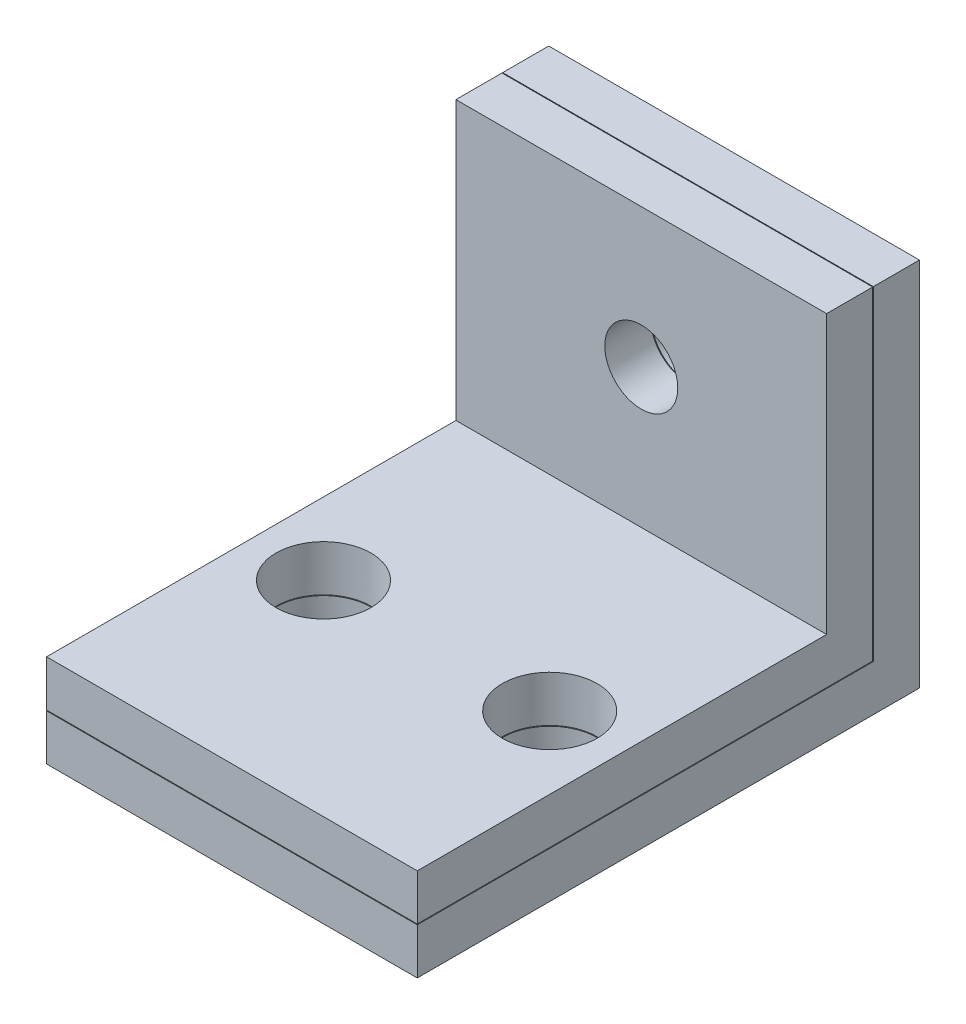
ISO-10303-21;
HEADER;
FILE_DESCRIPTION(('STEP AP214'),'2;1');
FILE_NAME('part.step','',(''),(''),'','','');
FILE_SCHEMA(('AUTOMOTIVE_DESIGN { 1 0 10303 214 1 1 1 1 }'));
ENDSEC;
DATA;
#1=APPLICATION_CONTEXT('core data for automotive mechanical design processes');
#2=APPLICATION_PROTOCOL_DEFINITION('international standard','automotive_design',2000,#1);
#3=PRODUCT_CONTEXT('',#1,'mechanical');
#4=PRODUCT('Part','Part','',(#3));
#5=PRODUCT_RELATED_PRODUCT_CATEGORY('part','',(#4));
#6=PRODUCT_DEFINITION_FORMATION('','',#4);
#7=PRODUCT_DEFINITION_CONTEXT('part definition',#1,'design');
#8=PRODUCT_DEFINITION('design','',#6,#7);
#9=PRODUCT_DEFINITION_SHAPE('','',#8);
#10=(LENGTH_UNIT() NAMED_UNIT(*) SI_UNIT(.MILLI.,.METRE.));
#11=(NAMED_UNIT(*) PLANE_ANGLE_UNIT() SI_UNIT($,.RADIAN.));
#12=(NAMED_UNIT(*) SI_UNIT($,.STERADIAN.) SOLID_ANGLE_UNIT());
#13=UNCERTAINTY_MEASURE_WITH_UNIT(LENGTH_MEASURE(1.E-05),#10,'distance_accuracy_value','');
#14=(GEOMETRIC_REPRESENTATION_CONTEXT(3) GLOBAL_UNCERTAINTY_ASSIGNED_CONTEXT((#13)) GLOBAL_UNIT_ASSIGNED_CONTEXT((#10,
#11,#12)) REPRESENTATION_CONTEXT('',''));
#15=CARTESIAN_POINT('',(0.,0.,0.));
#16=DIRECTION('',(0.,0.,1.));
#17=DIRECTION('',(1.,0.,0.));
#18=AXIS2_PLACEMENT_3D('',#15,#16,#17);
#19=CARTESIAN_POINT('',(0.,12.72,0.));
#20=DIRECTION('',(0.,0.,1.));
#21=DIRECTION('',(1.,0.,0.));
#22=AXIS2_PLACEMENT_3D('',#19,#20,#21);
#23=PLANE('',#22);
#24=DIRECTION('',(0.,-1.,0.));
#25=VECTOR('',#24,1.);
#26=CARTESIAN_POINT('',(50.8,12.72,0.));
#27=LINE('',#26,#25);
#28=CARTESIAN_POINT('',(50.8,12.72,0.));
#29=VERTEX_POINT('',#28);
#30=CARTESIAN_POINT('',(50.8,6.41,0.));
#31=VERTEX_POINT('',#30);
#32=EDGE_CURVE('E129',#29,#31,#27,.T.);
#33=ORIENTED_EDGE('',*,*,#32,.F.);
#34=DIRECTION('',(1.,0.,0.));
#35=VECTOR('',#34,1.);
#36=CARTESIAN_POINT('',(0.,12.72,0.));
#37=LINE('',#36,#35);
#38=CARTESIAN_POINT('',(0.,12.72,0.));
#39=VERTEX_POINT('',#38);
#40=EDGE_CURVE('E12',#39,#29,#37,.T.);
#41=ORIENTED_EDGE('',*,*,#40,.F.);
#42=DIRECTION('',(0.,-1.,0.));
#43=VECTOR('',#42,1.);
#44=CARTESIAN_POINT('',(0.,12.72,0.));
#45=LINE('',#44,#43);
#46=CARTESIAN_POINT('',(0.,6.41,0.));
#47=VERTEX_POINT('',#46);
#48=EDGE_CURVE('E144',#39,#47,#45,.T.);
#49=ORIENTED_EDGE('',*,*,#48,.T.);
#50=DIRECTION('',(1.,0.,0.));
#51=VECTOR('',#50,1.);
#52=CARTESIAN_POINT('',(0.,6.41,0.));
#53=LINE('',#52,#51);
#54=EDGE_CURVE('E93',#47,#31,#53,.T.);
#55=ORIENTED_EDGE('',*,*,#54,.T.);
#56=EDGE_LOOP('',(#33,#41,#49,#55));
#57=FACE_BOUND('',#56,.T.);
#58=ADVANCED_FACE('F43',(#57),#23,.T.);
#59=CARTESIAN_POINT('',(0.,12.72,0.));
#60=DIRECTION('',(0.,1.,0.));
#61=DIRECTION('',(0.,0.,1.));
#62=AXIS2_PLACEMENT_3D('',#59,#60,#61);
#63=PLANE('',#62);
#64=CARTESIAN_POINT('',(9.9,12.72,-28.05));
#65=DIRECTION('',(0.,1.,0.));
#66=DIRECTION('',(0.,0.,1.));
#67=AXIS2_PLACEMENT_3D('',#64,#65,#66);
#68=CIRCLE('',#67,6.50000000000001);
#69=CARTESIAN_POINT('',(9.9,12.72,-21.55));
#70=VERTEX_POINT('',#69);
#71=EDGE_CURVE('E153',#70,#70,#68,.T.);
#72=ORIENTED_EDGE('',*,*,#71,.F.);
#73=EDGE_LOOP('',(#72));
#74=FACE_BOUND('',#73,.T.);
#75=CARTESIAN_POINT('',(40.9,12.72,-28.05));
#76=DIRECTION('',(0.,1.,0.));
#77=DIRECTION('',(0.,0.,1.));
#78=AXIS2_PLACEMENT_3D('',#75,#76,#77);
#79=CIRCLE('',#78,6.5);
#80=CARTESIAN_POINT('',(40.9,12.72,-21.55));
#81=VERTEX_POINT('',#80);
#82=EDGE_CURVE('E170',#81,#81,#79,.T.);
#83=ORIENTED_EDGE('',*,*,#82,.F.);
#84=EDGE_LOOP('',(#83));
#85=FACE_BOUND('',#84,.T.);
#86=DIRECTION('',(0.,0.,1.));
#87=VECTOR('',#86,1.);
#88=CARTESIAN_POINT('',(50.8,12.72,0.));
#89=LINE('',#88,#87);
#90=CARTESIAN_POINT('',(50.8,12.72,-56.1));
#91=VERTEX_POINT('',#90);
#92=EDGE_CURVE('E142',#91,#29,#89,.T.);
#93=ORIENTED_EDGE('',*,*,#92,.F.);
#94=DIRECTION('',(1.,0.,0.));
#95=VECTOR('',#94,1.);
#96=CARTESIAN_POINT('',(0.,12.72,-56.1));
#97=LINE('',#96,#95);
#98=CARTESIAN_POINT('',(0.,12.72,-56.1));
#99=VERTEX_POINT('',#98);
#100=EDGE_CURVE('E52',#99,#91,#97,.T.);
#101=ORIENTED_EDGE('',*,*,#100,.F.);
#102=DIRECTION('',(0.,0.,1.));
#103=VECTOR('',#102,1.);
#104=CARTESIAN_POINT('',(0.,12.72,0.));
#105=LINE('',#104,#103);
#106=EDGE_CURVE('E119',#99,#39,#105,.T.);
#107=ORIENTED_EDGE('',*,*,#106,.T.);
#108=ORIENTED_EDGE('',*,*,#40,.T.);
#109=EDGE_LOOP('',(#93,#101,#107,#108));
#110=FACE_BOUND('',#109,.T.);
#111=ADVANCED_FACE('F187',(#74,#85,#110),#63,.T.);
#112=CARTESIAN_POINT('',(0.,12.72,-56.1));
#113=DIRECTION('',(0.,0.,1.));
#114=DIRECTION('',(1.,0.,0.));
#115=AXIS2_PLACEMENT_3D('',#112,#113,#114);
#116=PLANE('',#115);
#117=CARTESIAN_POINT('',(25.4,31.76,-56.1));
#118=DIRECTION('',(0.,0.,1.));
#119=DIRECTION('',(1.,0.,0.));
#120=AXIS2_PLACEMENT_3D('',#117,#118,#119);
#121=CIRCLE('',#120,5.);
#122=CARTESIAN_POINT('',(30.4,31.76,-56.1));
#123=VERTEX_POINT('',#122);
#124=EDGE_CURVE('E175',#123,#123,#121,.T.);
#125=ORIENTED_EDGE('',*,*,#124,.F.);
#126=EDGE_LOOP('',(#125));
#127=FACE_BOUND('',#126,.T.);
#128=DIRECTION('',(0.,-1.,0.));
#129=VECTOR('',#128,1.);
#130=CARTESIAN_POINT('',(50.8,12.72,-56.1));
#131=LINE('',#130,#129);
#132=CARTESIAN_POINT('',(50.8,50.8,-56.1));
#133=VERTEX_POINT('',#132);
#134=EDGE_CURVE('E106',#133,#91,#131,.T.);
#135=ORIENTED_EDGE('',*,*,#134,.F.);
#136=DIRECTION('',(1.,0.,0.));
#137=VECTOR('',#136,1.);
#138=CARTESIAN_POINT('',(0.,50.8,-56.1));
#139=LINE('',#138,#137);
#140=CARTESIAN_POINT('',(0.,50.8,-56.1));
#141=VERTEX_POINT('',#140);
#142=EDGE_CURVE('E101',#141,#133,#139,.T.);
#143=ORIENTED_EDGE('',*,*,#142,.F.);
#144=DIRECTION('',(0.,-1.,0.));
#145=VECTOR('',#144,1.);
#146=CARTESIAN_POINT('',(0.,12.72,-56.1));
#147=LINE('',#146,#145);
#148=EDGE_CURVE('E104',#141,#99,#147,.T.);
#149=ORIENTED_EDGE('',*,*,#148,.T.);
#150=ORIENTED_EDGE('',*,*,#100,.T.);
#151=EDGE_LOOP('',(#135,#143,#149,#150));
#152=FACE_BOUND('',#151,.T.);
#153=ADVANCED_FACE('F103',(#127,#152),#116,.T.);
#154=CARTESIAN_POINT('',(0.,50.8,-56.1));
#155=DIRECTION('',(0.,1.,0.));
#156=DIRECTION('',(0.,0.,1.));
#157=AXIS2_PLACEMENT_3D('',#154,#155,#156);
#158=PLANE('',#157);
#159=DIRECTION('',(0.,0.,1.));
#160=VECTOR('',#159,1.);
#161=CARTESIAN_POINT('',(50.8,50.8,-56.1));
#162=LINE('',#161,#160);
#163=CARTESIAN_POINT('',(50.8,50.8,-62.41));
#164=VERTEX_POINT('',#163);
#165=EDGE_CURVE('E139',#164,#133,#162,.T.);
#166=ORIENTED_EDGE('',*,*,#165,.F.);
#167=DIRECTION('',(1.,0.,0.));
#168=VECTOR('',#167,1.);
#169=CARTESIAN_POINT('',(0.,50.8,-62.41));
#170=LINE('',#169,#168);
#171=CARTESIAN_POINT('',(0.,50.8,-62.41));
#172=VERTEX_POINT('',#171);
#173=EDGE_CURVE('E111',#172,#164,#170,.T.);
#174=ORIENTED_EDGE('',*,*,#173,.F.);
#175=DIRECTION('',(0.,0.,1.));
#176=VECTOR('',#175,1.);
#177=CARTESIAN_POINT('',(0.,50.8,-56.1));
#178=LINE('',#177,#176);
#179=EDGE_CURVE('E117',#172,#141,#178,.T.);
#180=ORIENTED_EDGE('',*,*,#179,.T.);
#181=ORIENTED_EDGE('',*,*,#142,.T.);
#182=EDGE_LOOP('',(#166,#174,#180,#181));
#183=FACE_BOUND('',#182,.T.);
#184=ADVANCED_FACE('F121',(#183),#158,.T.);
#185=CARTESIAN_POINT('',(0.,6.41,-62.41));
#186=DIRECTION('',(0.,0.,-1.));
#187=DIRECTION('',(-1.,0.,0.));
#188=AXIS2_PLACEMENT_3D('',#185,#186,#187);
#189=PLANE('',#188);
#190=CARTESIAN_POINT('',(25.4,31.76,-62.41));
#191=DIRECTION('',(0.,0.,-1.));
#192=DIRECTION('',(-1.,0.,0.));
#193=AXIS2_PLACEMENT_3D('',#190,#191,#192);
#194=CIRCLE('',#193,5.);
#195=CARTESIAN_POINT('',(20.4,31.76,-62.41));
#196=VERTEX_POINT('',#195);
#197=EDGE_CURVE('E46',#196,#196,#194,.T.);
#198=ORIENTED_EDGE('',*,*,#197,.F.);
#199=EDGE_LOOP('',(#198));
#200=FACE_BOUND('',#199,.T.);
#201=DIRECTION('',(0.,1.,0.));
#202=VECTOR('',#201,1.);
#203=CARTESIAN_POINT('',(50.8,6.41,-62.41));
#204=LINE('',#203,#202);
#205=CARTESIAN_POINT('',(50.8,6.41,-62.41));
#206=VERTEX_POINT('',#205);
#207=EDGE_CURVE('E136',#206,#164,#204,.T.);
#208=ORIENTED_EDGE('',*,*,#207,.F.);
#209=DIRECTION('',(1.,0.,0.));
#210=VECTOR('',#209,1.);
#211=CARTESIAN_POINT('',(0.,6.41,-62.41));
#212=LINE('',#211,#210);
#213=CARTESIAN_POINT('',(0.,6.41,-62.41));
#214=VERTEX_POINT('',#213);
#215=EDGE_CURVE('E148',#214,#206,#212,.T.);
#216=ORIENTED_EDGE('',*,*,#215,.F.);
#217=DIRECTION('',(0.,1.,0.));
#218=VECTOR('',#217,1.);
#219=CARTESIAN_POINT('',(0.,6.41,-62.41));
#220=LINE('',#219,#218);
#221=EDGE_CURVE('E122',#214,#172,#220,.T.);
#222=ORIENTED_EDGE('',*,*,#221,.T.);
#223=ORIENTED_EDGE('',*,*,#173,.T.);
#224=EDGE_LOOP('',(#208,#216,#222,#223));
#225=FACE_BOUND('',#224,.T.);
#226=ADVANCED_FACE('F163',(#200,#225),#189,.T.);
#227=CARTESIAN_POINT('',(0.,6.41,0.));
#228=DIRECTION('',(0.,-1.,0.));
#229=DIRECTION('',(0.,0.,-1.));
#230=AXIS2_PLACEMENT_3D('',#227,#228,#229);
#231=PLANE('',#230);
#232=CARTESIAN_POINT('',(9.9,6.41,-28.05));
#233=DIRECTION('',(0.,-1.,0.));
#234=DIRECTION('',(0.,0.,-1.));
#235=AXIS2_PLACEMENT_3D('',#232,#233,#234);
#236=CIRCLE('',#235,6.50000000000001);
#237=CARTESIAN_POINT('',(9.9,6.41,-34.55));
#238=VERTEX_POINT('',#237);
#239=EDGE_CURVE('E133',#238,#238,#236,.T.);
#240=ORIENTED_EDGE('',*,*,#239,.F.);
#241=EDGE_LOOP('',(#240));
#242=FACE_BOUND('',#241,.T.);
#243=CARTESIAN_POINT('',(40.9,6.41,-28.05));
#244=DIRECTION('',(0.,-1.,0.));
#245=DIRECTION('',(0.,0.,-1.));
#246=AXIS2_PLACEMENT_3D('',#243,#244,#245);
#247=CIRCLE('',#246,6.5);
#248=CARTESIAN_POINT('',(40.9,6.41,-34.55));
#249=VERTEX_POINT('',#248);
#250=EDGE_CURVE('E151',#249,#249,#247,.T.);
#251=ORIENTED_EDGE('',*,*,#250,.F.);
#252=EDGE_LOOP('',(#251));
#253=FACE_BOUND('',#252,.T.);
#254=DIRECTION('',(0.,0.,-1.));
#255=VECTOR('',#254,1.);
#256=CARTESIAN_POINT('',(50.8,6.41,0.));
#257=LINE('',#256,#255);
#258=EDGE_CURVE('E132',#31,#206,#257,.T.);
#259=ORIENTED_EDGE('',*,*,#258,.F.);
#260=ORIENTED_EDGE('',*,*,#54,.F.);
#261=DIRECTION('',(0.,0.,-1.));
#262=VECTOR('',#261,1.);
#263=CARTESIAN_POINT('',(0.,6.41,0.));
#264=LINE('',#263,#262);
#265=EDGE_CURVE('E124',#47,#214,#264,.T.);
#266=ORIENTED_EDGE('',*,*,#265,.T.);
#267=ORIENTED_EDGE('',*,*,#215,.T.);
#268=EDGE_LOOP('',(#259,#260,#266,#267));
#269=FACE_BOUND('',#268,.T.);
#270=ADVANCED_FACE('F160',(#242,#253,#269),#231,.T.);
#271=CARTESIAN_POINT('',(0.,0.,0.));
#272=DIRECTION('',(1.,0.,0.));
#273=DIRECTION('',(0.,0.,-1.));
#274=AXIS2_PLACEMENT_3D('',#271,#272,#273);
#275=PLANE('',#274);
#276=ORIENTED_EDGE('',*,*,#48,.F.);
#277=ORIENTED_EDGE('',*,*,#106,.F.);
#278=ORIENTED_EDGE('',*,*,#148,.F.);
#279=ORIENTED_EDGE('',*,*,#179,.F.);
#280=ORIENTED_EDGE('',*,*,#221,.F.);
#281=ORIENTED_EDGE('',*,*,#265,.F.);
#282=EDGE_LOOP('',(#276,#277,#278,#279,#280,#281));
#283=FACE_BOUND('',#282,.T.);
#284=ADVANCED_FACE('F115',(#283),#275,.F.);
#285=CARTESIAN_POINT('',(50.8,0.,0.));
#286=DIRECTION('',(1.,0.,0.));
#287=DIRECTION('',(0.,0.,-1.));
#288=AXIS2_PLACEMENT_3D('',#285,#286,#287);
#289=PLANE('',#288);
#290=ORIENTED_EDGE('',*,*,#32,.T.);
#291=ORIENTED_EDGE('',*,*,#258,.T.);
#292=ORIENTED_EDGE('',*,*,#207,.T.);
#293=ORIENTED_EDGE('',*,*,#165,.T.);
#294=ORIENTED_EDGE('',*,*,#134,.T.);
#295=ORIENTED_EDGE('',*,*,#92,.T.);
#296=EDGE_LOOP('',(#290,#291,#292,#293,#294,#295));
#297=FACE_BOUND('',#296,.T.);
#298=ADVANCED_FACE('F167',(#297),#289,.T.);
#299=CARTESIAN_POINT('',(40.9,-85.08,-28.05));
#300=DIRECTION('',(0.,1.,0.));
#301=DIRECTION('',(0.,0.,1.));
#302=AXIS2_PLACEMENT_3D('',#299,#300,#301);
#303=CYLINDRICAL_SURFACE('',#302,6.5);
#304=ORIENTED_EDGE('',*,*,#250,.T.);
#305=EDGE_LOOP('',(#304));
#306=FACE_BOUND('',#305,.T.);
#307=ORIENTED_EDGE('',*,*,#82,.T.);
#308=EDGE_LOOP('',(#307));
#309=FACE_BOUND('',#308,.T.);
#310=ADVANCED_FACE('F234',(#306,#309),#303,.F.);
#311=CARTESIAN_POINT('',(9.9,-85.08,-28.05));
#312=DIRECTION('',(0.,1.,0.));
#313=DIRECTION('',(0.,0.,1.));
#314=AXIS2_PLACEMENT_3D('',#311,#312,#313);
#315=CYLINDRICAL_SURFACE('',#314,6.50000000000001);
#316=ORIENTED_EDGE('',*,*,#239,.T.);
#317=EDGE_LOOP('',(#316));
#318=FACE_BOUND('',#317,.T.);
#319=ORIENTED_EDGE('',*,*,#71,.T.);
#320=EDGE_LOOP('',(#319));
#321=FACE_BOUND('',#320,.T.);
#322=ADVANCED_FACE('F157',(#318,#321),#315,.F.);
#323=CARTESIAN_POINT('',(25.4,31.76,-78.1));
#324=DIRECTION('',(0.,0.,1.));
#325=DIRECTION('',(1.,0.,0.));
#326=AXIS2_PLACEMENT_3D('',#323,#324,#325);
#327=CYLINDRICAL_SURFACE('',#326,5.);
#328=ORIENTED_EDGE('',*,*,#197,.T.);
#329=EDGE_LOOP('',(#328));
#330=FACE_BOUND('',#329,.T.);
#331=ORIENTED_EDGE('',*,*,#124,.T.);
#332=EDGE_LOOP('',(#331));
#333=FACE_BOUND('',#332,.T.);
#334=ADVANCED_FACE('F182',(#330,#333),#327,.F.);
#335=CLOSED_SHELL('',(#58,#111,#153,#184,#226,#270,#284,#298,#310,#322,#334));
#336=MANIFOLD_SOLID_BREP('B2',#335);
#337=CARTESIAN_POINT('',(50.8,6.31,0.));
#338=DIRECTION('',(0.,0.,-1.));
#339=DIRECTION('',(-1.,0.,0.));
#340=AXIS2_PLACEMENT_3D('',#337,#338,#339);
#341=PLANE('',#340);
#342=DIRECTION('',(0.,-1.,0.));
#343=VECTOR('',#342,1.);
#344=CARTESIAN_POINT('',(0.,6.31,0.));
#345=LINE('',#344,#343);
#346=CARTESIAN_POINT('',(0.,6.31,0.));
#347=VERTEX_POINT('',#346);
#348=CARTESIAN_POINT('',(0.,0.,0.));
#349=VERTEX_POINT('',#348);
#350=EDGE_CURVE('E368',#347,#349,#345,.T.);
#351=ORIENTED_EDGE('',*,*,#350,.T.);
#352=DIRECTION('',(-1.,0.,0.));
#353=VECTOR('',#352,1.);
#354=CARTESIAN_POINT('',(50.8,0.,0.));
#355=LINE('',#354,#353);
#356=CARTESIAN_POINT('',(50.8,0.,0.));
#357=VERTEX_POINT('',#356);
#358=EDGE_CURVE('E41',#357,#349,#355,.T.);
#359=ORIENTED_EDGE('',*,*,#358,.F.);
#360=DIRECTION('',(0.,-1.,0.));
#361=VECTOR('',#360,1.);
#362=CARTESIAN_POINT('',(50.8,6.31,0.));
#363=LINE('',#362,#361);
#364=CARTESIAN_POINT('',(50.8,6.31,0.));
#365=VERTEX_POINT('',#364);
#366=EDGE_CURVE('E379',#365,#357,#363,.T.);
#367=ORIENTED_EDGE('',*,*,#366,.F.);
#368=DIRECTION('',(-1.,0.,0.));
#369=VECTOR('',#368,1.);
#370=CARTESIAN_POINT('',(50.8,6.31,0.));
#371=LINE('',#370,#369);
#372=EDGE_CURVE('E364',#365,#347,#371,.T.);
#373=ORIENTED_EDGE('',*,*,#372,.T.);
#374=EDGE_LOOP('',(#351,#359,#367,#373));
#375=FACE_BOUND('',#374,.T.);
#376=ADVANCED_FACE('F282',(#375),#341,.F.);
#377=CARTESIAN_POINT('',(50.8,0.,0.));
#378=DIRECTION('',(0.,1.,0.));
#379=DIRECTION('',(0.,0.,1.));
#380=AXIS2_PLACEMENT_3D('',#377,#378,#379);
#381=PLANE('',#380);
#382=CARTESIAN_POINT('',(9.9,0.,-28.05));
#383=DIRECTION('',(0.,1.,0.));
#384=DIRECTION('',(0.,0.,1.));
#385=AXIS2_PLACEMENT_3D('',#382,#383,#384);
#386=CIRCLE('',#385,6.50000000000001);
#387=CARTESIAN_POINT('',(9.9,0.,-21.55));
#388=VERTEX_POINT('',#387);
#389=EDGE_CURVE('E372',#388,#388,#386,.T.);
#390=ORIENTED_EDGE('',*,*,#389,.T.);
#391=EDGE_LOOP('',(#390));
#392=FACE_BOUND('',#391,.T.);
#393=CARTESIAN_POINT('',(40.9,0.,-28.05));
#394=DIRECTION('',(0.,1.,0.));
#395=DIRECTION('',(0.,0.,1.));
#396=AXIS2_PLACEMENT_3D('',#393,#394,#395);
#397=CIRCLE('',#396,6.5);
#398=CARTESIAN_POINT('',(40.9,0.,-21.55));
#399=VERTEX_POINT('',#398);
#400=EDGE_CURVE('E387',#399,#399,#397,.T.);
#401=ORIENTED_EDGE('',*,*,#400,.T.);
#402=EDGE_LOOP('',(#401));
#403=FACE_BOUND('',#402,.T.);
#404=DIRECTION('',(0.,0.,-1.));
#405=VECTOR('',#404,1.);
#406=CARTESIAN_POINT('',(0.,0.,0.));
#407=LINE('',#406,#405);
#408=CARTESIAN_POINT('',(0.,0.,-68.82));
#409=VERTEX_POINT('',#408);
#410=EDGE_CURVE('E371',#349,#409,#407,.T.);
#411=ORIENTED_EDGE('',*,*,#410,.T.);
#412=DIRECTION('',(-1.,0.,0.));
#413=VECTOR('',#412,1.);
#414=CARTESIAN_POINT('',(50.8,0.,-68.82));
#415=LINE('',#414,#413);
#416=CARTESIAN_POINT('',(50.8,0.,-68.82));
#417=VERTEX_POINT('',#416);
#418=EDGE_CURVE('E291',#417,#409,#415,.T.);
#419=ORIENTED_EDGE('',*,*,#418,.F.);
#420=DIRECTION('',(0.,0.,-1.));
#421=VECTOR('',#420,1.);
#422=CARTESIAN_POINT('',(50.8,0.,0.));
#423=LINE('',#422,#421);
#424=EDGE_CURVE('E337',#357,#417,#423,.T.);
#425=ORIENTED_EDGE('',*,*,#424,.F.);
#426=ORIENTED_EDGE('',*,*,#358,.T.);
#427=EDGE_LOOP('',(#411,#419,#425,#426));
#428=FACE_BOUND('',#427,.T.);
#429=ADVANCED_FACE('F404',(#392,#403,#428),#381,.F.);
#430=CARTESIAN_POINT('',(50.8,0.,-68.82));
#431=DIRECTION('',(0.,0.,1.));
#432=DIRECTION('',(1.,0.,0.));
#433=AXIS2_PLACEMENT_3D('',#430,#431,#432);
#434=PLANE('',#433);
#435=CARTESIAN_POINT('',(25.4,31.76,-68.82));
#436=DIRECTION('',(0.,0.,1.));
#437=DIRECTION('',(1.,0.,0.));
#438=AXIS2_PLACEMENT_3D('',#435,#436,#437);
#439=CIRCLE('',#438,5.);
#440=CARTESIAN_POINT('',(30.4,31.76,-68.82));
#441=VERTEX_POINT('',#440);
#442=EDGE_CURVE('E388',#441,#441,#439,.T.);
#443=ORIENTED_EDGE('',*,*,#442,.T.);
#444=EDGE_LOOP('',(#443));
#445=FACE_BOUND('',#444,.T.);
#446=DIRECTION('',(0.,1.,0.));
#447=VECTOR('',#446,1.);
#448=CARTESIAN_POINT('',(0.,0.,-68.82));
#449=LINE('',#448,#447);
#450=CARTESIAN_POINT('',(0.,50.8,-68.82));
#451=VERTEX_POINT('',#450);
#452=EDGE_CURVE('E374',#409,#451,#449,.T.);
#453=ORIENTED_EDGE('',*,*,#452,.T.);
#454=DIRECTION('',(-1.,0.,0.));
#455=VECTOR('',#454,1.);
#456=CARTESIAN_POINT('',(50.8,50.8,-68.82));
#457=LINE('',#456,#455);
#458=CARTESIAN_POINT('',(50.8,50.8,-68.82));
#459=VERTEX_POINT('',#458);
#460=EDGE_CURVE('E359',#459,#451,#457,.T.);
#461=ORIENTED_EDGE('',*,*,#460,.F.);
#462=DIRECTION('',(0.,1.,0.));
#463=VECTOR('',#462,1.);
#464=CARTESIAN_POINT('',(50.8,0.,-68.82));
#465=LINE('',#464,#463);
#466=EDGE_CURVE('E350',#417,#459,#465,.T.);
#467=ORIENTED_EDGE('',*,*,#466,.F.);
#468=ORIENTED_EDGE('',*,*,#418,.T.);
#469=EDGE_LOOP('',(#453,#461,#467,#468));
#470=FACE_BOUND('',#469,.T.);
#471=ADVANCED_FACE('F407',(#445,#470),#434,.F.);
#472=CARTESIAN_POINT('',(50.8,50.8,-62.51));
#473=DIRECTION('',(0.,-1.,0.));
#474=DIRECTION('',(0.,0.,-1.));
#475=AXIS2_PLACEMENT_3D('',#472,#473,#474);
#476=PLANE('',#475);
#477=DIRECTION('',(0.,0.,1.));
#478=VECTOR('',#477,1.);
#479=CARTESIAN_POINT('',(0.,50.8,-62.51));
#480=LINE('',#479,#478);
#481=CARTESIAN_POINT('',(0.,50.8,-62.51));
#482=VERTEX_POINT('',#481);
#483=EDGE_CURVE('E358',#451,#482,#480,.T.);
#484=ORIENTED_EDGE('',*,*,#483,.T.);
#485=DIRECTION('',(-1.,0.,0.));
#486=VECTOR('',#485,1.);
#487=CARTESIAN_POINT('',(50.8,50.8,-62.51));
#488=LINE('',#487,#486);
#489=CARTESIAN_POINT('',(50.8,50.8,-62.51));
#490=VERTEX_POINT('',#489);
#491=EDGE_CURVE('E355',#490,#482,#488,.T.);
#492=ORIENTED_EDGE('',*,*,#491,.F.);
#493=DIRECTION('',(0.,0.,1.));
#494=VECTOR('',#493,1.);
#495=CARTESIAN_POINT('',(50.8,50.8,-62.51));
#496=LINE('',#495,#494);
#497=EDGE_CURVE('E344',#459,#490,#496,.T.);
#498=ORIENTED_EDGE('',*,*,#497,.F.);
#499=ORIENTED_EDGE('',*,*,#460,.T.);
#500=EDGE_LOOP('',(#484,#492,#498,#499));
#501=FACE_BOUND('',#500,.T.);
#502=ADVANCED_FACE('F356',(#501),#476,.F.);
#503=CARTESIAN_POINT('',(50.8,6.31,-62.51));
#504=DIRECTION('',(0.,0.,-1.));
#505=DIRECTION('',(-1.,0.,0.));
#506=AXIS2_PLACEMENT_3D('',#503,#504,#505);
#507=PLANE('',#506);
#508=CARTESIAN_POINT('',(25.4,31.76,-62.51));
#509=DIRECTION('',(0.,0.,-1.));
#510=DIRECTION('',(-1.,0.,0.));
#511=AXIS2_PLACEMENT_3D('',#508,#509,#510);
#512=CIRCLE('',#511,5.);
#513=CARTESIAN_POINT('',(20.4,31.76,-62.51));
#514=VERTEX_POINT('',#513);
#515=EDGE_CURVE('E285',#514,#514,#512,.T.);
#516=ORIENTED_EDGE('',*,*,#515,.T.);
#517=EDGE_LOOP('',(#516));
#518=FACE_BOUND('',#517,.T.);
#519=DIRECTION('',(0.,-1.,0.));
#520=VECTOR('',#519,1.);
#521=CARTESIAN_POINT('',(0.,6.31,-62.51));
#522=LINE('',#521,#520);
#523=CARTESIAN_POINT('',(0.,6.31,-62.51));
#524=VERTEX_POINT('',#523);
#525=EDGE_CURVE('E323',#482,#524,#522,.T.);
#526=ORIENTED_EDGE('',*,*,#525,.T.);
#527=DIRECTION('',(-1.,0.,0.));
#528=VECTOR('',#527,1.);
#529=CARTESIAN_POINT('',(50.8,6.31,-62.51));
#530=LINE('',#529,#528);
#531=CARTESIAN_POINT('',(50.8,6.31,-62.51));
#532=VERTEX_POINT('',#531);
#533=EDGE_CURVE('E360',#532,#524,#530,.T.);
#534=ORIENTED_EDGE('',*,*,#533,.F.);
#535=DIRECTION('',(0.,-1.,0.));
#536=VECTOR('',#535,1.);
#537=CARTESIAN_POINT('',(50.8,6.31,-62.51));
#538=LINE('',#537,#536);
#539=EDGE_CURVE('E348',#490,#532,#538,.T.);
#540=ORIENTED_EDGE('',*,*,#539,.F.);
#541=ORIENTED_EDGE('',*,*,#491,.T.);
#542=EDGE_LOOP('',(#526,#534,#540,#541));
#543=FACE_BOUND('',#542,.T.);
#544=ADVANCED_FACE('F362',(#518,#543),#507,.F.);
#545=CARTESIAN_POINT('',(50.8,6.31,0.));
#546=DIRECTION('',(0.,-1.,0.));
#547=DIRECTION('',(0.,0.,-1.));
#548=AXIS2_PLACEMENT_3D('',#545,#546,#547);
#549=PLANE('',#548);
#550=CARTESIAN_POINT('',(9.9,6.31,-28.05));
#551=DIRECTION('',(0.,-1.,0.));
#552=DIRECTION('',(0.,0.,-1.));
#553=AXIS2_PLACEMENT_3D('',#550,#551,#552);
#554=CIRCLE('',#553,6.50000000000001);
#555=CARTESIAN_POINT('',(9.9,6.31,-34.55));
#556=VERTEX_POINT('',#555);
#557=EDGE_CURVE('E389',#556,#556,#554,.T.);
#558=ORIENTED_EDGE('',*,*,#557,.T.);
#559=EDGE_LOOP('',(#558));
#560=FACE_BOUND('',#559,.T.);
#561=CARTESIAN_POINT('',(40.9,6.31,-28.05));
#562=DIRECTION('',(0.,-1.,0.));
#563=DIRECTION('',(0.,0.,-1.));
#564=AXIS2_PLACEMENT_3D('',#561,#562,#563);
#565=CIRCLE('',#564,6.5);
#566=CARTESIAN_POINT('',(40.9,6.31,-34.55));
#567=VERTEX_POINT('',#566);
#568=EDGE_CURVE('E385',#567,#567,#565,.T.);
#569=ORIENTED_EDGE('',*,*,#568,.T.);
#570=EDGE_LOOP('',(#569));
#571=FACE_BOUND('',#570,.T.);
#572=DIRECTION('',(0.,0.,1.));
#573=VECTOR('',#572,1.);
#574=CARTESIAN_POINT('',(0.,6.31,0.));
#575=LINE('',#574,#573);
#576=EDGE_CURVE('E329',#524,#347,#575,.T.);
#577=ORIENTED_EDGE('',*,*,#576,.T.);
#578=ORIENTED_EDGE('',*,*,#372,.F.);
#579=DIRECTION('',(0.,0.,1.));
#580=VECTOR('',#579,1.);
#581=CARTESIAN_POINT('',(50.8,6.31,0.));
#582=LINE('',#581,#580);
#583=EDGE_CURVE('E300',#532,#365,#582,.T.);
#584=ORIENTED_EDGE('',*,*,#583,.F.);
#585=ORIENTED_EDGE('',*,*,#533,.T.);
#586=EDGE_LOOP('',(#577,#578,#584,#585));
#587=FACE_BOUND('',#586,.T.);
#588=ADVANCED_FACE('F412',(#560,#571,#587),#549,.F.);
#589=CARTESIAN_POINT('',(50.8,0.,0.));
#590=DIRECTION('',(1.,0.,0.));
#591=DIRECTION('',(0.,0.,-1.));
#592=AXIS2_PLACEMENT_3D('',#589,#590,#591);
#593=PLANE('',#592);
#594=ORIENTED_EDGE('',*,*,#366,.T.);
#595=ORIENTED_EDGE('',*,*,#424,.T.);
#596=ORIENTED_EDGE('',*,*,#466,.T.);
#597=ORIENTED_EDGE('',*,*,#497,.T.);
#598=ORIENTED_EDGE('',*,*,#539,.T.);
#599=ORIENTED_EDGE('',*,*,#583,.T.);
#600=EDGE_LOOP('',(#594,#595,#596,#597,#598,#599));
#601=FACE_BOUND('',#600,.T.);
#602=ADVANCED_FACE('F346',(#601),#593,.T.);
#603=CARTESIAN_POINT('',(0.,0.,0.));
#604=DIRECTION('',(1.,0.,0.));
#605=DIRECTION('',(0.,0.,-1.));
#606=AXIS2_PLACEMENT_3D('',#603,#604,#605);
#607=PLANE('',#606);
#608=ORIENTED_EDGE('',*,*,#350,.F.);
#609=ORIENTED_EDGE('',*,*,#576,.F.);
#610=ORIENTED_EDGE('',*,*,#525,.F.);
#611=ORIENTED_EDGE('',*,*,#483,.F.);
#612=ORIENTED_EDGE('',*,*,#452,.F.);
#613=ORIENTED_EDGE('',*,*,#410,.F.);
#614=EDGE_LOOP('',(#608,#609,#610,#611,#612,#613));
#615=FACE_BOUND('',#614,.T.);
#616=ADVANCED_FACE('F410',(#615),#607,.F.);
#617=CARTESIAN_POINT('',(40.9,-85.08,-28.05));
#618=DIRECTION('',(0.,1.,0.));
#619=DIRECTION('',(0.,0.,1.));
#620=AXIS2_PLACEMENT_3D('',#617,#618,#619);
#621=CYLINDRICAL_SURFACE('',#620,6.5);
#622=ORIENTED_EDGE('',*,*,#568,.F.);
#623=EDGE_LOOP('',(#622));
#624=FACE_BOUND('',#623,.T.);
#625=ORIENTED_EDGE('',*,*,#400,.F.);
#626=EDGE_LOOP('',(#625));
#627=FACE_BOUND('',#626,.T.);
#628=ADVANCED_FACE('F463',(#624,#627),#621,.F.);
#629=CARTESIAN_POINT('',(9.9,-85.08,-28.05));
#630=DIRECTION('',(0.,1.,0.));
#631=DIRECTION('',(0.,0.,1.));
#632=AXIS2_PLACEMENT_3D('',#629,#630,#631);
#633=CYLINDRICAL_SURFACE('',#632,6.50000000000001);
#634=ORIENTED_EDGE('',*,*,#557,.F.);
#635=EDGE_LOOP('',(#634));
#636=FACE_BOUND('',#635,.T.);
#637=ORIENTED_EDGE('',*,*,#389,.F.);
#638=EDGE_LOOP('',(#637));
#639=FACE_BOUND('',#638,.T.);
#640=ADVANCED_FACE('F468',(#636,#639),#633,.F.);
#641=CARTESIAN_POINT('',(25.4,31.76,-78.1));
#642=DIRECTION('',(0.,0.,1.));
#643=DIRECTION('',(1.,0.,0.));
#644=AXIS2_PLACEMENT_3D('',#641,#642,#643);
#645=CYLINDRICAL_SURFACE('',#644,5.);
#646=ORIENTED_EDGE('',*,*,#515,.F.);
#647=EDGE_LOOP('',(#646));
#648=FACE_BOUND('',#647,.T.);
#649=ORIENTED_EDGE('',*,*,#442,.F.);
#650=EDGE_LOOP('',(#649));
#651=FACE_BOUND('',#650,.T.);
#652=ADVANCED_FACE('F476',(#648,#651),#645,.F.);
#653=CLOSED_SHELL('',(#376,#429,#471,#502,#544,#588,#602,#616,#628,#640,#652));
#654=MANIFOLD_SOLID_BREP('B6',#653);
#655=ADVANCED_BREP_SHAPE_REPRESENTATION('',(#18,#336,#654),#14);
#656=SHAPE_DEFINITION_REPRESENTATION(#9,#655);
ENDSEC;
END-ISO-10303-21;
